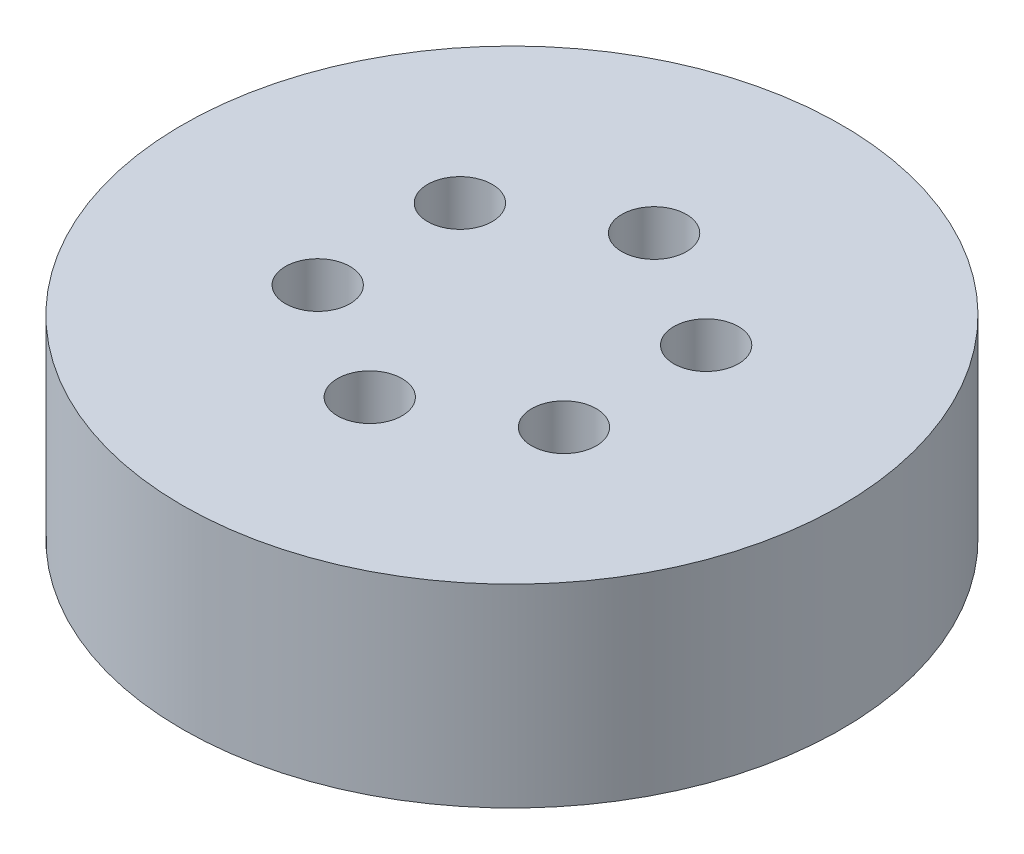
ISO-10303-21;
HEADER;
FILE_DESCRIPTION(('STEP AP214'),'2;1');
FILE_NAME('part.step','',(''),(''),'','','');
FILE_SCHEMA(('AUTOMOTIVE_DESIGN { 1 0 10303 214 1 1 1 1 }'));
ENDSEC;
DATA;
#1=APPLICATION_CONTEXT('core data for automotive mechanical design processes');
#2=APPLICATION_PROTOCOL_DEFINITION('international standard','automotive_design',2000,#1);
#3=PRODUCT_CONTEXT('',#1,'mechanical');
#4=PRODUCT('Part','Part','',(#3));
#5=PRODUCT_RELATED_PRODUCT_CATEGORY('part','',(#4));
#6=PRODUCT_DEFINITION_FORMATION('','',#4);
#7=PRODUCT_DEFINITION_CONTEXT('part definition',#1,'design');
#8=PRODUCT_DEFINITION('design','',#6,#7);
#9=PRODUCT_DEFINITION_SHAPE('','',#8);
#10=(LENGTH_UNIT() NAMED_UNIT(*) SI_UNIT(.MILLI.,.METRE.));
#11=(NAMED_UNIT(*) PLANE_ANGLE_UNIT() SI_UNIT($,.RADIAN.));
#12=(NAMED_UNIT(*) SI_UNIT($,.STERADIAN.) SOLID_ANGLE_UNIT());
#13=UNCERTAINTY_MEASURE_WITH_UNIT(LENGTH_MEASURE(1.E-05),#10,'distance_accuracy_value','');
#14=(GEOMETRIC_REPRESENTATION_CONTEXT(3) GLOBAL_UNCERTAINTY_ASSIGNED_CONTEXT((#13)) GLOBAL_UNIT_ASSIGNED_CONTEXT((#10,
#11,#12)) REPRESENTATION_CONTEXT('',''));
#15=CARTESIAN_POINT('',(0.,0.,0.));
#16=DIRECTION('',(0.,0.,1.));
#17=DIRECTION('',(1.,0.,0.));
#18=AXIS2_PLACEMENT_3D('',#15,#16,#17);
#19=CARTESIAN_POINT('',(0.,15.,0.));
#20=DIRECTION('',(0.,1.,0.));
#21=DIRECTION('',(0.,0.,1.));
#22=AXIS2_PLACEMENT_3D('',#19,#20,#21);
#23=PLANE('',#22);
#24=CARTESIAN_POINT('',(-9.52627944162882,15.,5.5));
#25=DIRECTION('',(0.,1.,0.));
#26=DIRECTION('',(0.,0.,1.));
#27=AXIS2_PLACEMENT_3D('',#24,#25,#26);
#28=CIRCLE('',#27,2.5);
#29=CARTESIAN_POINT('',(-9.52627944162882,15.,8.));
#30=VERTEX_POINT('',#29);
#31=EDGE_CURVE('E80',#30,#30,#28,.T.);
#32=ORIENTED_EDGE('',*,*,#31,.F.);
#33=EDGE_LOOP('',(#32));
#34=FACE_BOUND('',#33,.T.);
#35=CARTESIAN_POINT('',(9.52627944162882,15.,5.49999999999999));
#36=DIRECTION('',(0.,1.,0.));
#37=DIRECTION('',(0.,0.,1.));
#38=AXIS2_PLACEMENT_3D('',#35,#36,#37);
#39=CIRCLE('',#38,2.5);
#40=CARTESIAN_POINT('',(9.52627944162882,15.,7.99999999999999));
#41=VERTEX_POINT('',#40);
#42=EDGE_CURVE('E64',#41,#41,#39,.T.);
#43=ORIENTED_EDGE('',*,*,#42,.F.);
#44=EDGE_LOOP('',(#43));
#45=FACE_BOUND('',#44,.T.);
#46=CARTESIAN_POINT('',(9.52627944162882,15.,-5.50000000000001));
#47=DIRECTION('',(0.,1.,0.));
#48=DIRECTION('',(0.,0.,1.));
#49=AXIS2_PLACEMENT_3D('',#46,#47,#48);
#50=CIRCLE('',#49,2.5);
#51=CARTESIAN_POINT('',(9.52627944162882,15.,-3.00000000000001));
#52=VERTEX_POINT('',#51);
#53=EDGE_CURVE('E50',#52,#52,#50,.T.);
#54=ORIENTED_EDGE('',*,*,#53,.F.);
#55=EDGE_LOOP('',(#54));
#56=FACE_BOUND('',#55,.T.);
#57=CARTESIAN_POINT('',(0.,15.,0.));
#58=DIRECTION('',(0.,1.,0.));
#59=DIRECTION('',(0.,0.,1.));
#60=AXIS2_PLACEMENT_3D('',#57,#58,#59);
#61=CIRCLE('',#60,25.5);
#62=CARTESIAN_POINT('',(0.,15.,25.5));
#63=VERTEX_POINT('',#62);
#64=EDGE_CURVE('E10',#63,#63,#61,.T.);
#65=ORIENTED_EDGE('',*,*,#64,.T.);
#66=EDGE_LOOP('',(#65));
#67=FACE_BOUND('',#66,.T.);
#68=CARTESIAN_POINT('',(0.,15.,-11.));
#69=DIRECTION('',(0.,1.,0.));
#70=DIRECTION('',(0.,0.,1.));
#71=AXIS2_PLACEMENT_3D('',#68,#69,#70);
#72=CIRCLE('',#71,2.5);
#73=CARTESIAN_POINT('',(0.,15.,-8.5));
#74=VERTEX_POINT('',#73);
#75=EDGE_CURVE('E56',#74,#74,#72,.T.);
#76=ORIENTED_EDGE('',*,*,#75,.F.);
#77=EDGE_LOOP('',(#76));
#78=FACE_BOUND('',#77,.T.);
#79=CARTESIAN_POINT('',(0.,15.,11.));
#80=DIRECTION('',(0.,1.,0.));
#81=DIRECTION('',(0.,0.,1.));
#82=AXIS2_PLACEMENT_3D('',#79,#80,#81);
#83=CIRCLE('',#82,2.5);
#84=CARTESIAN_POINT('',(0.,15.,13.5));
#85=VERTEX_POINT('',#84);
#86=EDGE_CURVE('E72',#85,#85,#83,.T.);
#87=ORIENTED_EDGE('',*,*,#86,.F.);
#88=EDGE_LOOP('',(#87));
#89=FACE_BOUND('',#88,.T.);
#90=CARTESIAN_POINT('',(-9.52627944162882,15.,-5.5));
#91=DIRECTION('',(0.,1.,0.));
#92=DIRECTION('',(0.,0.,1.));
#93=AXIS2_PLACEMENT_3D('',#90,#91,#92);
#94=CIRCLE('',#93,2.5);
#95=CARTESIAN_POINT('',(-9.52627944162882,15.,-3.));
#96=VERTEX_POINT('',#95);
#97=EDGE_CURVE('E88',#96,#96,#94,.T.);
#98=ORIENTED_EDGE('',*,*,#97,.F.);
#99=EDGE_LOOP('',(#98));
#100=FACE_BOUND('',#99,.T.);
#101=ADVANCED_FACE('F37',(#34,#45,#56,#67,#78,#89,#100),#23,.T.);
#102=CARTESIAN_POINT('',(0.,0.,0.));
#103=DIRECTION('',(0.,1.,0.));
#104=DIRECTION('',(0.,0.,1.));
#105=AXIS2_PLACEMENT_3D('',#102,#103,#104);
#106=PLANE('',#105);
#107=CARTESIAN_POINT('',(0.,0.,0.));
#108=DIRECTION('',(0.,1.,0.));
#109=DIRECTION('',(0.,0.,1.));
#110=AXIS2_PLACEMENT_3D('',#107,#108,#109);
#111=CIRCLE('',#110,25.5);
#112=CARTESIAN_POINT('',(0.,0.,25.5));
#113=VERTEX_POINT('',#112);
#114=EDGE_CURVE('E41',#113,#113,#111,.T.);
#115=ORIENTED_EDGE('',*,*,#114,.F.);
#116=EDGE_LOOP('',(#115));
#117=FACE_BOUND('',#116,.T.);
#118=CARTESIAN_POINT('',(9.52627944162882,0.,-5.50000000000001));
#119=DIRECTION('',(0.,1.,0.));
#120=DIRECTION('',(0.,0.,1.));
#121=AXIS2_PLACEMENT_3D('',#118,#119,#120);
#122=CIRCLE('',#121,2.5);
#123=CARTESIAN_POINT('',(9.52627944162882,0.,-3.00000000000001));
#124=VERTEX_POINT('',#123);
#125=EDGE_CURVE('E52',#124,#124,#122,.T.);
#126=ORIENTED_EDGE('',*,*,#125,.T.);
#127=EDGE_LOOP('',(#126));
#128=FACE_BOUND('',#127,.T.);
#129=CARTESIAN_POINT('',(0.,0.,-11.));
#130=DIRECTION('',(0.,1.,0.));
#131=DIRECTION('',(0.,0.,1.));
#132=AXIS2_PLACEMENT_3D('',#129,#130,#131);
#133=CIRCLE('',#132,2.5);
#134=CARTESIAN_POINT('',(0.,0.,-8.5));
#135=VERTEX_POINT('',#134);
#136=EDGE_CURVE('E60',#135,#135,#133,.T.);
#137=ORIENTED_EDGE('',*,*,#136,.T.);
#138=EDGE_LOOP('',(#137));
#139=FACE_BOUND('',#138,.T.);
#140=CARTESIAN_POINT('',(9.52627944162882,0.,5.49999999999999));
#141=DIRECTION('',(0.,1.,0.));
#142=DIRECTION('',(0.,0.,1.));
#143=AXIS2_PLACEMENT_3D('',#140,#141,#142);
#144=CIRCLE('',#143,2.5);
#145=CARTESIAN_POINT('',(9.52627944162882,0.,7.99999999999999));
#146=VERTEX_POINT('',#145);
#147=EDGE_CURVE('E68',#146,#146,#144,.T.);
#148=ORIENTED_EDGE('',*,*,#147,.T.);
#149=EDGE_LOOP('',(#148));
#150=FACE_BOUND('',#149,.T.);
#151=CARTESIAN_POINT('',(0.,0.,11.));
#152=DIRECTION('',(0.,1.,0.));
#153=DIRECTION('',(0.,0.,1.));
#154=AXIS2_PLACEMENT_3D('',#151,#152,#153);
#155=CIRCLE('',#154,2.5);
#156=CARTESIAN_POINT('',(0.,0.,13.5));
#157=VERTEX_POINT('',#156);
#158=EDGE_CURVE('E76',#157,#157,#155,.T.);
#159=ORIENTED_EDGE('',*,*,#158,.T.);
#160=EDGE_LOOP('',(#159));
#161=FACE_BOUND('',#160,.T.);
#162=CARTESIAN_POINT('',(-9.52627944162882,0.,5.5));
#163=DIRECTION('',(0.,1.,0.));
#164=DIRECTION('',(0.,0.,1.));
#165=AXIS2_PLACEMENT_3D('',#162,#163,#164);
#166=CIRCLE('',#165,2.5);
#167=CARTESIAN_POINT('',(-9.52627944162882,0.,8.));
#168=VERTEX_POINT('',#167);
#169=EDGE_CURVE('E84',#168,#168,#166,.T.);
#170=ORIENTED_EDGE('',*,*,#169,.T.);
#171=EDGE_LOOP('',(#170));
#172=FACE_BOUND('',#171,.T.);
#173=CARTESIAN_POINT('',(-9.52627944162882,0.,-5.5));
#174=DIRECTION('',(0.,1.,0.));
#175=DIRECTION('',(0.,0.,1.));
#176=AXIS2_PLACEMENT_3D('',#173,#174,#175);
#177=CIRCLE('',#176,2.5);
#178=CARTESIAN_POINT('',(-9.52627944162882,0.,-3.));
#179=VERTEX_POINT('',#178);
#180=EDGE_CURVE('E92',#179,#179,#177,.T.);
#181=ORIENTED_EDGE('',*,*,#180,.T.);
#182=EDGE_LOOP('',(#181));
#183=FACE_BOUND('',#182,.T.);
#184=ADVANCED_FACE('F104',(#117,#128,#139,#150,#161,#172,#183),#106,.F.);
#185=CARTESIAN_POINT('',(0.,15.,0.));
#186=DIRECTION('',(0.,-1.,0.));
#187=DIRECTION('',(0.,0.,-1.));
#188=AXIS2_PLACEMENT_3D('',#185,#186,#187);
#189=CYLINDRICAL_SURFACE('',#188,25.5);
#190=ORIENTED_EDGE('',*,*,#64,.F.);
#191=EDGE_LOOP('',(#190));
#192=FACE_BOUND('',#191,.T.);
#193=ORIENTED_EDGE('',*,*,#114,.T.);
#194=EDGE_LOOP('',(#193));
#195=FACE_BOUND('',#194,.T.);
#196=ADVANCED_FACE('F39',(#192,#195),#189,.T.);
#197=CARTESIAN_POINT('',(9.52627944162882,15.,-5.50000000000001));
#198=DIRECTION('',(0.,-1.,0.));
#199=DIRECTION('',(0.,0.,-1.));
#200=AXIS2_PLACEMENT_3D('',#197,#198,#199);
#201=CYLINDRICAL_SURFACE('',#200,2.5);
#202=ORIENTED_EDGE('',*,*,#53,.T.);
#203=EDGE_LOOP('',(#202));
#204=FACE_BOUND('',#203,.T.);
#205=ORIENTED_EDGE('',*,*,#125,.F.);
#206=EDGE_LOOP('',(#205));
#207=FACE_BOUND('',#206,.T.);
#208=ADVANCED_FACE('F114',(#204,#207),#201,.F.);
#209=CARTESIAN_POINT('',(0.,15.,-11.));
#210=DIRECTION('',(0.,-1.,0.));
#211=DIRECTION('',(0.,0.,-1.));
#212=AXIS2_PLACEMENT_3D('',#209,#210,#211);
#213=CYLINDRICAL_SURFACE('',#212,2.5);
#214=ORIENTED_EDGE('',*,*,#75,.T.);
#215=EDGE_LOOP('',(#214));
#216=FACE_BOUND('',#215,.T.);
#217=ORIENTED_EDGE('',*,*,#136,.F.);
#218=EDGE_LOOP('',(#217));
#219=FACE_BOUND('',#218,.T.);
#220=ADVANCED_FACE('F117',(#216,#219),#213,.F.);
#221=CARTESIAN_POINT('',(9.52627944162882,15.,5.49999999999999));
#222=DIRECTION('',(0.,-1.,0.));
#223=DIRECTION('',(0.,0.,-1.));
#224=AXIS2_PLACEMENT_3D('',#221,#222,#223);
#225=CYLINDRICAL_SURFACE('',#224,2.5);
#226=ORIENTED_EDGE('',*,*,#42,.T.);
#227=EDGE_LOOP('',(#226));
#228=FACE_BOUND('',#227,.T.);
#229=ORIENTED_EDGE('',*,*,#147,.F.);
#230=EDGE_LOOP('',(#229));
#231=FACE_BOUND('',#230,.T.);
#232=ADVANCED_FACE('F121',(#228,#231),#225,.F.);
#233=CARTESIAN_POINT('',(0.,15.,11.));
#234=DIRECTION('',(0.,-1.,0.));
#235=DIRECTION('',(0.,0.,-1.));
#236=AXIS2_PLACEMENT_3D('',#233,#234,#235);
#237=CYLINDRICAL_SURFACE('',#236,2.5);
#238=ORIENTED_EDGE('',*,*,#86,.T.);
#239=EDGE_LOOP('',(#238));
#240=FACE_BOUND('',#239,.T.);
#241=ORIENTED_EDGE('',*,*,#158,.F.);
#242=EDGE_LOOP('',(#241));
#243=FACE_BOUND('',#242,.T.);
#244=ADVANCED_FACE('F125',(#240,#243),#237,.F.);
#245=CARTESIAN_POINT('',(-9.52627944162882,15.,5.5));
#246=DIRECTION('',(0.,-1.,0.));
#247=DIRECTION('',(0.,0.,-1.));
#248=AXIS2_PLACEMENT_3D('',#245,#246,#247);
#249=CYLINDRICAL_SURFACE('',#248,2.5);
#250=ORIENTED_EDGE('',*,*,#31,.T.);
#251=EDGE_LOOP('',(#250));
#252=FACE_BOUND('',#251,.T.);
#253=ORIENTED_EDGE('',*,*,#169,.F.);
#254=EDGE_LOOP('',(#253));
#255=FACE_BOUND('',#254,.T.);
#256=ADVANCED_FACE('F129',(#252,#255),#249,.F.);
#257=CARTESIAN_POINT('',(-9.52627944162882,15.,-5.5));
#258=DIRECTION('',(0.,-1.,0.));
#259=DIRECTION('',(0.,0.,-1.));
#260=AXIS2_PLACEMENT_3D('',#257,#258,#259);
#261=CYLINDRICAL_SURFACE('',#260,2.5);
#262=ORIENTED_EDGE('',*,*,#97,.T.);
#263=EDGE_LOOP('',(#262));
#264=FACE_BOUND('',#263,.T.);
#265=ORIENTED_EDGE('',*,*,#180,.F.);
#266=EDGE_LOOP('',(#265));
#267=FACE_BOUND('',#266,.T.);
#268=ADVANCED_FACE('F100',(#264,#267),#261,.F.);
#269=CLOSED_SHELL('',(#101,#184,#196,#208,#220,#232,#244,#256,#268));
#270=MANIFOLD_SOLID_BREP('B2',#269);
#271=ADVANCED_BREP_SHAPE_REPRESENTATION('',(#18,#270),#14);
#272=SHAPE_DEFINITION_REPRESENTATION(#9,#271);
ENDSEC;
END-ISO-10303-21;
